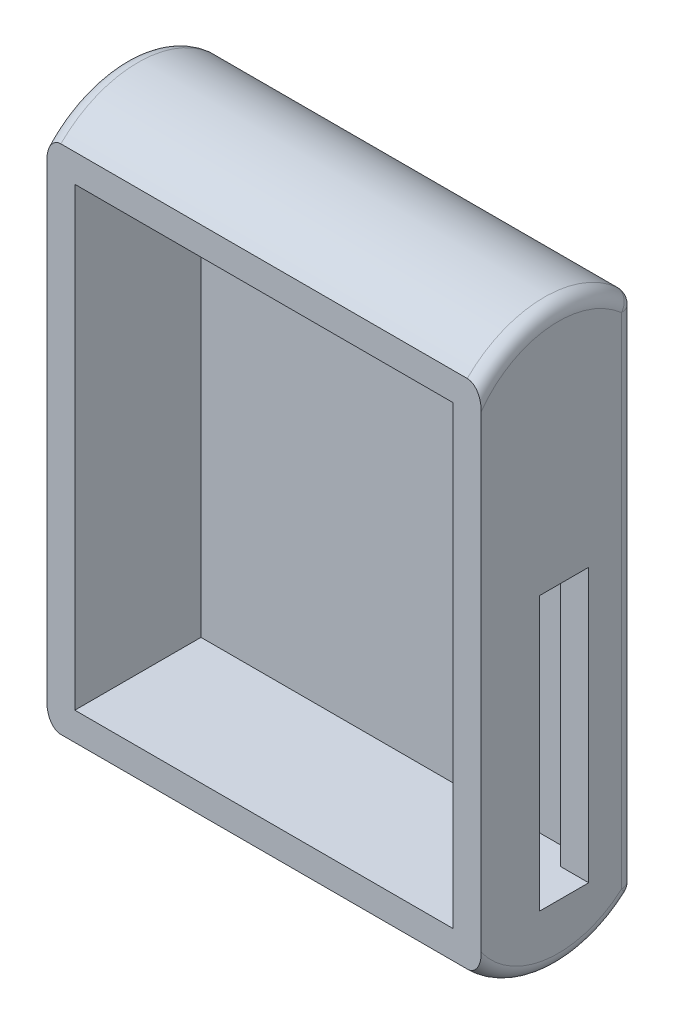
ISO-10303-21;
HEADER;
FILE_DESCRIPTION(('STEP AP214'),'2;1');
FILE_NAME('part.step','',(''),(''),'','','');
FILE_SCHEMA(('AUTOMOTIVE_DESIGN { 1 0 10303 214 1 1 1 1 }'));
ENDSEC;
DATA;
#1=APPLICATION_CONTEXT('core data for automotive mechanical design processes');
#2=APPLICATION_PROTOCOL_DEFINITION('international standard','automotive_design',2000,#1);
#3=PRODUCT_CONTEXT('',#1,'mechanical');
#4=PRODUCT('Part','Part','',(#3));
#5=PRODUCT_RELATED_PRODUCT_CATEGORY('part','',(#4));
#6=PRODUCT_DEFINITION_FORMATION('','',#4);
#7=PRODUCT_DEFINITION_CONTEXT('part definition',#1,'design');
#8=PRODUCT_DEFINITION('design','',#6,#7);
#9=PRODUCT_DEFINITION_SHAPE('','',#8);
#10=(LENGTH_UNIT() NAMED_UNIT(*) SI_UNIT(.MILLI.,.METRE.));
#11=(NAMED_UNIT(*) PLANE_ANGLE_UNIT() SI_UNIT($,.RADIAN.));
#12=(NAMED_UNIT(*) SI_UNIT($,.STERADIAN.) SOLID_ANGLE_UNIT());
#13=UNCERTAINTY_MEASURE_WITH_UNIT(LENGTH_MEASURE(1.E-05),#10,'distance_accuracy_value','');
#14=(GEOMETRIC_REPRESENTATION_CONTEXT(3) GLOBAL_UNCERTAINTY_ASSIGNED_CONTEXT((#13)) GLOBAL_UNIT_ASSIGNED_CONTEXT((#10,
#11,#12)) REPRESENTATION_CONTEXT('',''));
#15=CARTESIAN_POINT('',(0.,0.,0.));
#16=DIRECTION('',(0.,0.,1.));
#17=DIRECTION('',(1.,0.,0.));
#18=AXIS2_PLACEMENT_3D('',#15,#16,#17);
#19=CARTESIAN_POINT('',(0.,0.,0.));
#20=DIRECTION('',(0.,0.,1.));
#21=DIRECTION('',(1.,0.,0.));
#22=AXIS2_PLACEMENT_3D('',#19,#20,#21);
#23=PLANE('',#22);
#24=DIRECTION('',(-1.,0.,0.));
#25=VECTOR('',#24,1.);
#26=CARTESIAN_POINT('',(-15.5,-17.8188904914089,0.));
#27=LINE('',#26,#25);
#28=CARTESIAN_POINT('',(14.5,-17.8188904914089,0.));
#29=VERTEX_POINT('',#28);
#30=CARTESIAN_POINT('',(-14.5,-17.8188904914089,0.));
#31=VERTEX_POINT('',#30);
#32=EDGE_CURVE('E258',#29,#31,#27,.T.);
#33=ORIENTED_EDGE('',*,*,#32,.T.);
#34=DIRECTION('',(0.,-1.,0.));
#35=VECTOR('',#34,1.);
#36=CARTESIAN_POINT('',(-14.5,0.,0.));
#37=LINE('',#36,#35);
#38=CARTESIAN_POINT('',(-14.5,17.8188904914089,0.));
#39=VERTEX_POINT('',#38);
#40=EDGE_CURVE('E11',#31,#39,#37,.F.);
#41=ORIENTED_EDGE('',*,*,#40,.T.);
#42=DIRECTION('',(-1.,0.,0.));
#43=VECTOR('',#42,1.);
#44=CARTESIAN_POINT('',(14.5,17.8188904914089,0.));
#45=LINE('',#44,#43);
#46=CARTESIAN_POINT('',(14.5,17.8188904914089,0.));
#47=VERTEX_POINT('',#46);
#48=EDGE_CURVE('E306',#39,#47,#45,.F.);
#49=ORIENTED_EDGE('',*,*,#48,.T.);
#50=DIRECTION('',(0.,1.,0.));
#51=VECTOR('',#50,1.);
#52=CARTESIAN_POINT('',(14.5,0.,0.));
#53=LINE('',#52,#51);
#54=EDGE_CURVE('E251',#47,#29,#53,.F.);
#55=ORIENTED_EDGE('',*,*,#54,.T.);
#56=EDGE_LOOP('',(#33,#41,#49,#55));
#57=FACE_BOUND('',#56,.T.);
#58=ADVANCED_FACE('F37',(#57),#23,.F.);
#59=CARTESIAN_POINT('',(15.5,18.25,9.));
#60=DIRECTION('',(-1.,0.,0.));
#61=DIRECTION('',(0.,0.,1.));
#62=AXIS2_PLACEMENT_3D('',#59,#60,#61);
#63=PLANE('',#62);
#64=DIRECTION('',(0.,0.,1.));
#65=VECTOR('',#64,1.);
#66=CARTESIAN_POINT('',(15.5,-16.25,9.));
#67=LINE('',#66,#65);
#68=CARTESIAN_POINT('',(15.5,-16.25,3.33269746106328));
#69=VERTEX_POINT('',#68);
#70=CARTESIAN_POINT('',(15.5,-16.25,6.83269746106328));
#71=VERTEX_POINT('',#70);
#72=EDGE_CURVE('E194',#69,#71,#67,.T.);
#73=ORIENTED_EDGE('',*,*,#72,.T.);
#74=DIRECTION('',(0.,1.,0.));
#75=VECTOR('',#74,1.);
#76=CARTESIAN_POINT('',(15.5,18.25,6.83269746106328));
#77=LINE('',#76,#75);
#78=CARTESIAN_POINT('',(15.5,3.25000000000001,6.83269746106328));
#79=VERTEX_POINT('',#78);
#80=EDGE_CURVE('E197',#71,#79,#77,.T.);
#81=ORIENTED_EDGE('',*,*,#80,.T.);
#82=DIRECTION('',(0.,0.,-1.));
#83=VECTOR('',#82,1.);
#84=CARTESIAN_POINT('',(15.5,3.25000000000001,9.));
#85=LINE('',#84,#83);
#86=CARTESIAN_POINT('',(15.5,3.25000000000001,3.33269746106328));
#87=VERTEX_POINT('',#86);
#88=EDGE_CURVE('E169',#79,#87,#85,.T.);
#89=ORIENTED_EDGE('',*,*,#88,.T.);
#90=DIRECTION('',(0.,-1.,0.));
#91=VECTOR('',#90,1.);
#92=CARTESIAN_POINT('',(15.5,18.25,3.33269746106328));
#93=LINE('',#92,#91);
#94=EDGE_CURVE('E191',#87,#69,#93,.T.);
#95=ORIENTED_EDGE('',*,*,#94,.T.);
#96=EDGE_LOOP('',(#73,#81,#89,#95));
#97=FACE_BOUND('',#96,.T.);
#98=DIRECTION('',(0.,1.,0.));
#99=VECTOR('',#98,1.);
#100=CARTESIAN_POINT('',(15.5,18.25,0.999999999999999));
#101=LINE('',#100,#99);
#102=CARTESIAN_POINT('',(15.5,-17.8188904914089,0.999999999999999));
#103=VERTEX_POINT('',#102);
#104=CARTESIAN_POINT('',(15.5,17.8188904914089,0.999999999999999));
#105=VERTEX_POINT('',#104);
#106=EDGE_CURVE('E248',#103,#105,#101,.T.);
#107=ORIENTED_EDGE('',*,*,#106,.T.);
#108=CARTESIAN_POINT('',(15.5,12.75,5.5));
#109=DIRECTION('',(-1.,0.,0.));
#110=DIRECTION('',(0.,0.,1.));
#111=AXIS2_PLACEMENT_3D('',#108,#109,#110);
#112=CIRCLE('',#111,6.77817459305202);
#113=CARTESIAN_POINT('',(15.5,16.7115212752043,11.));
#114=VERTEX_POINT('',#113);
#115=EDGE_CURVE('E300',#105,#114,#112,.F.);
#116=ORIENTED_EDGE('',*,*,#115,.T.);
#117=DIRECTION('',(0.,1.,0.));
#118=VECTOR('',#117,1.);
#119=CARTESIAN_POINT('',(15.5,18.25,11.));
#120=LINE('',#119,#118);
#121=CARTESIAN_POINT('',(15.5,-16.7115212752043,11.));
#122=VERTEX_POINT('',#121);
#123=EDGE_CURVE('E222',#122,#114,#120,.T.);
#124=ORIENTED_EDGE('',*,*,#123,.F.);
#125=CARTESIAN_POINT('',(15.5,-12.75,5.5));
#126=DIRECTION('',(-1.,0.,0.));
#127=DIRECTION('',(0.,0.,1.));
#128=AXIS2_PLACEMENT_3D('',#125,#126,#127);
#129=CIRCLE('',#128,6.77817459305203);
#130=EDGE_CURVE('E261',#122,#103,#129,.F.);
#131=ORIENTED_EDGE('',*,*,#130,.T.);
#132=EDGE_LOOP('',(#107,#116,#124,#131));
#133=FACE_BOUND('',#132,.T.);
#134=ADVANCED_FACE('F355',(#97,#133),#63,.F.);
#135=CARTESIAN_POINT('',(-15.5,18.25,9.));
#136=DIRECTION('',(1.,0.,0.));
#137=DIRECTION('',(0.,1.,0.));
#138=AXIS2_PLACEMENT_3D('',#135,#136,#137);
#139=PLANE('',#138);
#140=DIRECTION('',(0.,-1.,0.));
#141=VECTOR('',#140,1.);
#142=CARTESIAN_POINT('',(-15.5,18.25,11.));
#143=LINE('',#142,#141);
#144=CARTESIAN_POINT('',(-15.5,16.7115212752043,11.));
#145=VERTEX_POINT('',#144);
#146=CARTESIAN_POINT('',(-15.5,-16.7115212752043,11.));
#147=VERTEX_POINT('',#146);
#148=EDGE_CURVE('E228',#145,#147,#143,.T.);
#149=ORIENTED_EDGE('',*,*,#148,.F.);
#150=CARTESIAN_POINT('',(-15.5,12.75,5.5));
#151=DIRECTION('',(1.,0.,0.));
#152=DIRECTION('',(0.,1.,0.));
#153=AXIS2_PLACEMENT_3D('',#150,#151,#152);
#154=CIRCLE('',#153,6.77817459305202);
#155=CARTESIAN_POINT('',(-15.5,17.8188904914089,0.999999999999999));
#156=VERTEX_POINT('',#155);
#157=EDGE_CURVE('E435',#145,#156,#154,.F.);
#158=ORIENTED_EDGE('',*,*,#157,.T.);
#159=DIRECTION('',(0.,-1.,0.));
#160=VECTOR('',#159,1.);
#161=CARTESIAN_POINT('',(-15.5,18.25,0.999999999999999));
#162=LINE('',#161,#160);
#163=CARTESIAN_POINT('',(-15.5,-17.8188904914089,0.999999999999999));
#164=VERTEX_POINT('',#163);
#165=EDGE_CURVE('E331',#156,#164,#162,.T.);
#166=ORIENTED_EDGE('',*,*,#165,.T.);
#167=CARTESIAN_POINT('',(-15.5,-12.75,5.5));
#168=DIRECTION('',(1.,0.,0.));
#169=DIRECTION('',(0.,1.,0.));
#170=AXIS2_PLACEMENT_3D('',#167,#168,#169);
#171=CIRCLE('',#170,6.77817459305203);
#172=EDGE_CURVE('E394',#164,#147,#171,.F.);
#173=ORIENTED_EDGE('',*,*,#172,.T.);
#174=EDGE_LOOP('',(#149,#158,#166,#173));
#175=FACE_BOUND('',#174,.T.);
#176=ADVANCED_FACE('F361',(#175),#139,.F.);
#177=CARTESIAN_POINT('',(13.5,-16.25,9.));
#178=DIRECTION('',(-1.,0.,0.));
#179=DIRECTION('',(0.,0.,1.));
#180=AXIS2_PLACEMENT_3D('',#177,#178,#179);
#181=PLANE('',#180);
#182=DIRECTION('',(0.,1.,0.));
#183=VECTOR('',#182,1.);
#184=CARTESIAN_POINT('',(13.5,-16.25,6.83269746106328));
#185=LINE('',#184,#183);
#186=CARTESIAN_POINT('',(13.5,-16.25,6.83269746106328));
#187=VERTEX_POINT('',#186);
#188=CARTESIAN_POINT('',(13.5,3.25000000000001,6.83269746106328));
#189=VERTEX_POINT('',#188);
#190=EDGE_CURVE('E174',#187,#189,#185,.T.);
#191=ORIENTED_EDGE('',*,*,#190,.F.);
#192=DIRECTION('',(0.,0.,-1.));
#193=VECTOR('',#192,1.);
#194=CARTESIAN_POINT('',(13.5,-16.25,9.));
#195=LINE('',#194,#193);
#196=CARTESIAN_POINT('',(13.5,-16.25,11.));
#197=VERTEX_POINT('',#196);
#198=EDGE_CURVE('E234',#197,#187,#195,.T.);
#199=ORIENTED_EDGE('',*,*,#198,.F.);
#200=DIRECTION('',(0.,1.,0.));
#201=VECTOR('',#200,1.);
#202=CARTESIAN_POINT('',(13.5,-16.25,11.));
#203=LINE('',#202,#201);
#204=CARTESIAN_POINT('',(13.5,16.25,11.));
#205=VERTEX_POINT('',#204);
#206=EDGE_CURVE('E210',#197,#205,#203,.T.);
#207=ORIENTED_EDGE('',*,*,#206,.T.);
#208=DIRECTION('',(0.,0.,-1.));
#209=VECTOR('',#208,1.);
#210=CARTESIAN_POINT('',(13.5,16.25,9.));
#211=LINE('',#210,#209);
#212=CARTESIAN_POINT('',(13.5,16.25,2.));
#213=VERTEX_POINT('',#212);
#214=EDGE_CURVE('E242',#205,#213,#211,.T.);
#215=ORIENTED_EDGE('',*,*,#214,.T.);
#216=DIRECTION('',(0.,1.,0.));
#217=VECTOR('',#216,1.);
#218=CARTESIAN_POINT('',(13.5,-16.25,2.));
#219=LINE('',#218,#217);
#220=CARTESIAN_POINT('',(13.5,-16.25,2.));
#221=VERTEX_POINT('',#220);
#222=EDGE_CURVE('E207',#221,#213,#219,.T.);
#223=ORIENTED_EDGE('',*,*,#222,.F.);
#224=CARTESIAN_POINT('',(13.5,-16.25,3.33269746106328));
#225=VERTEX_POINT('',#224);
#226=EDGE_CURVE('E233',#225,#221,#195,.T.);
#227=ORIENTED_EDGE('',*,*,#226,.F.);
#228=DIRECTION('',(0.,-1.,0.));
#229=VECTOR('',#228,1.);
#230=CARTESIAN_POINT('',(13.5,-16.25,3.33269746106328));
#231=LINE('',#230,#229);
#232=CARTESIAN_POINT('',(13.5,3.25000000000001,3.33269746106328));
#233=VERTEX_POINT('',#232);
#234=EDGE_CURVE('E62',#233,#225,#231,.T.);
#235=ORIENTED_EDGE('',*,*,#234,.F.);
#236=DIRECTION('',(0.,0.,-1.));
#237=VECTOR('',#236,1.);
#238=CARTESIAN_POINT('',(13.5,3.25000000000001,6.83269746106328));
#239=LINE('',#238,#237);
#240=EDGE_CURVE('E167',#189,#233,#239,.T.);
#241=ORIENTED_EDGE('',*,*,#240,.F.);
#242=EDGE_LOOP('',(#191,#199,#207,#215,#223,#227,#235,#241));
#243=FACE_BOUND('',#242,.T.);
#244=ADVANCED_FACE('F181',(#243),#181,.T.);
#245=CARTESIAN_POINT('',(-13.5,16.25,9.));
#246=DIRECTION('',(0.,-1.,0.));
#247=DIRECTION('',(0.,0.,-1.));
#248=AXIS2_PLACEMENT_3D('',#245,#246,#247);
#249=PLANE('',#248);
#250=DIRECTION('',(-1.,0.,0.));
#251=VECTOR('',#250,1.);
#252=CARTESIAN_POINT('',(-13.5,16.25,2.));
#253=LINE('',#252,#251);
#254=CARTESIAN_POINT('',(-13.5,16.25,2.));
#255=VERTEX_POINT('',#254);
#256=EDGE_CURVE('E203',#213,#255,#253,.T.);
#257=ORIENTED_EDGE('',*,*,#256,.F.);
#258=ORIENTED_EDGE('',*,*,#214,.F.);
#259=DIRECTION('',(-1.,0.,0.));
#260=VECTOR('',#259,1.);
#261=CARTESIAN_POINT('',(-13.5,16.25,11.));
#262=LINE('',#261,#260);
#263=CARTESIAN_POINT('',(-13.5,16.25,11.));
#264=VERTEX_POINT('',#263);
#265=EDGE_CURVE('E213',#205,#264,#262,.T.);
#266=ORIENTED_EDGE('',*,*,#265,.T.);
#267=DIRECTION('',(0.,0.,-1.));
#268=VECTOR('',#267,1.);
#269=CARTESIAN_POINT('',(-13.5,16.25,9.));
#270=LINE('',#269,#268);
#271=EDGE_CURVE('E239',#264,#255,#270,.T.);
#272=ORIENTED_EDGE('',*,*,#271,.T.);
#273=EDGE_LOOP('',(#257,#258,#266,#272));
#274=FACE_BOUND('',#273,.T.);
#275=ADVANCED_FACE('F466',(#274),#249,.T.);
#276=CARTESIAN_POINT('',(-13.5,-16.25,9.));
#277=DIRECTION('',(1.,0.,0.));
#278=DIRECTION('',(0.,0.,-1.));
#279=AXIS2_PLACEMENT_3D('',#276,#277,#278);
#280=PLANE('',#279);
#281=DIRECTION('',(0.,-1.,0.));
#282=VECTOR('',#281,1.);
#283=CARTESIAN_POINT('',(-13.5,-16.25,2.));
#284=LINE('',#283,#282);
#285=CARTESIAN_POINT('',(-13.5,-16.25,2.));
#286=VERTEX_POINT('',#285);
#287=EDGE_CURVE('E200',#255,#286,#284,.T.);
#288=ORIENTED_EDGE('',*,*,#287,.F.);
#289=ORIENTED_EDGE('',*,*,#271,.F.);
#290=DIRECTION('',(0.,-1.,0.));
#291=VECTOR('',#290,1.);
#292=CARTESIAN_POINT('',(-13.5,-16.25,11.));
#293=LINE('',#292,#291);
#294=CARTESIAN_POINT('',(-13.5,-16.25,11.));
#295=VERTEX_POINT('',#294);
#296=EDGE_CURVE('E216',#264,#295,#293,.T.);
#297=ORIENTED_EDGE('',*,*,#296,.T.);
#298=DIRECTION('',(0.,0.,-1.));
#299=VECTOR('',#298,1.);
#300=CARTESIAN_POINT('',(-13.5,-16.25,9.));
#301=LINE('',#300,#299);
#302=EDGE_CURVE('E236',#295,#286,#301,.T.);
#303=ORIENTED_EDGE('',*,*,#302,.T.);
#304=EDGE_LOOP('',(#288,#289,#297,#303));
#305=FACE_BOUND('',#304,.T.);
#306=ADVANCED_FACE('F460',(#305),#280,.T.);
#307=CARTESIAN_POINT('',(-13.5,-16.25,9.));
#308=DIRECTION('',(0.,1.,0.));
#309=DIRECTION('',(0.,0.,1.));
#310=AXIS2_PLACEMENT_3D('',#307,#308,#309);
#311=PLANE('',#310);
#312=DIRECTION('',(1.,0.,0.));
#313=VECTOR('',#312,1.);
#314=CARTESIAN_POINT('',(-13.5,-16.25,2.));
#315=LINE('',#314,#313);
#316=EDGE_CURVE('E245',#286,#221,#315,.T.);
#317=ORIENTED_EDGE('',*,*,#316,.F.);
#318=ORIENTED_EDGE('',*,*,#302,.F.);
#319=DIRECTION('',(1.,0.,0.));
#320=VECTOR('',#319,1.);
#321=CARTESIAN_POINT('',(-13.5,-16.25,11.));
#322=LINE('',#321,#320);
#323=EDGE_CURVE('E219',#295,#197,#322,.T.);
#324=ORIENTED_EDGE('',*,*,#323,.T.);
#325=ORIENTED_EDGE('',*,*,#198,.T.);
#326=DIRECTION('',(-1.,0.,0.));
#327=VECTOR('',#326,1.);
#328=CARTESIAN_POINT('',(44.5,-16.25,6.83269746106328));
#329=LINE('',#328,#327);
#330=EDGE_CURVE('E177',#71,#187,#329,.T.);
#331=ORIENTED_EDGE('',*,*,#330,.F.);
#332=ORIENTED_EDGE('',*,*,#72,.F.);
#333=DIRECTION('',(-1.,0.,0.));
#334=VECTOR('',#333,1.);
#335=CARTESIAN_POINT('',(44.5,-16.25,3.33269746106328));
#336=LINE('',#335,#334);
#337=EDGE_CURVE('E187',#69,#225,#336,.T.);
#338=ORIENTED_EDGE('',*,*,#337,.T.);
#339=ORIENTED_EDGE('',*,*,#226,.T.);
#340=EDGE_LOOP('',(#317,#318,#324,#325,#331,#332,#338,#339));
#341=FACE_BOUND('',#340,.T.);
#342=ADVANCED_FACE('F456',(#341),#311,.T.);
#343=CARTESIAN_POINT('',(0.,0.,11.));
#344=DIRECTION('',(0.,0.,1.));
#345=DIRECTION('',(1.,0.,0.));
#346=AXIS2_PLACEMENT_3D('',#343,#344,#345);
#347=PLANE('',#346);
#348=DIRECTION('',(-1.,0.,0.));
#349=VECTOR('',#348,1.);
#350=CARTESIAN_POINT('',(-15.5,18.25,11.));
#351=LINE('',#350,#349);
#352=CARTESIAN_POINT('',(14.5,18.25,11.));
#353=VERTEX_POINT('',#352);
#354=CARTESIAN_POINT('',(-14.5,18.25,11.));
#355=VERTEX_POINT('',#354);
#356=EDGE_CURVE('E225',#353,#355,#351,.T.);
#357=ORIENTED_EDGE('',*,*,#356,.T.);
#358=CARTESIAN_POINT('',(-14.5,18.25,11.));
#359=CARTESIAN_POINT('',(-14.5221746388345,18.2500035217024,11.));
#360=CARTESIAN_POINT('',(-14.5443359806786,18.2489560098945,11.));
#361=CARTESIAN_POINT('',(-14.5884502003951,18.2448023064981,11.));
#362=CARTESIAN_POINT('',(-14.6104032088881,18.2416975050493,11.));
#363=CARTESIAN_POINT('',(-14.6753444611963,18.2294313668087,11.));
#364=CARTESIAN_POINT('',(-14.7178052242068,18.2173165748259,11.));
#365=CARTESIAN_POINT('',(-14.7998833291316,18.1860749257143,11.));
#366=CARTESIAN_POINT('',(-14.8395070601081,18.1669644575222,11.));
#367=CARTESIAN_POINT('',(-14.9153654595189,18.1228185252904,11.));
#368=CARTESIAN_POINT('',(-14.9515930051118,18.0977709809261,11.));
#369=CARTESIAN_POINT('',(-15.0331103296372,18.0325871217042,11.));
#370=CARTESIAN_POINT('',(-15.07669166003,17.9903173454604,11.));
#371=CARTESIAN_POINT('',(-15.156462459106,17.8993551457087,11.));
#372=CARTESIAN_POINT('',(-15.1926416294551,17.850653927217,11.));
#373=CARTESIAN_POINT('',(-15.2721736159704,17.7267500628287,11.));
#374=CARTESIAN_POINT('',(-15.3118520971225,17.6492015077571,11.));
#375=CARTESIAN_POINT('',(-15.3787360924516,17.4887037275891,11.));
#376=CARTESIAN_POINT('',(-15.4058866459234,17.4057324945112,11.));
#377=CARTESIAN_POINT('',(-15.4404670543295,17.2713948968963,11.));
#378=CARTESIAN_POINT('',(-15.4514270024044,17.2208907790921,11.));
#379=CARTESIAN_POINT('',(-15.4698458775689,17.1192221448691,11.));
#380=CARTESIAN_POINT('',(-15.4773032233433,17.0680573408611,11.));
#381=CARTESIAN_POINT('',(-15.4889293631659,16.9660390728593,11.));
#382=CARTESIAN_POINT('',(-15.4931395877876,16.9151901884607,11.));
#383=CARTESIAN_POINT('',(-15.4986702573794,16.8133966185451,11.));
#384=CARTESIAN_POINT('',(-15.4999942928386,16.7624521310589,11.));
#385=CARTESIAN_POINT('',(-15.5,16.7115212752043,11.));
#386=B_SPLINE_CURVE_WITH_KNOTS('',3,(#358,#359,#360,#361,#362,#363,#364,#365,#366,#367,#368,
#369,#370,#371,#372,#373,#374,#375,#376,#377,#378,#379,#380,#381,#382,#383,#384,#385),
.UNSPECIFIED.,.F.,.F.,(4,2,2,2,2,2,2,2,2,2,2,2,2,4),(0.,0.0664738702492997,0.132902868904628,
0.264608044699189,0.396006625901944,0.527674897712099,0.70880799378726,0.89019140480687,
1.15009376099176,1.41112572895081,1.5660534987603,1.72105114653713,1.87403684529202,
2.02683211727188),.UNSPECIFIED.);
#387=EDGE_CURVE('E325',#355,#145,#386,.T.);
#388=ORIENTED_EDGE('',*,*,#387,.T.);
#389=ORIENTED_EDGE('',*,*,#148,.T.);
#390=CARTESIAN_POINT('',(-15.5,-16.7115212752043,11.));
#391=CARTESIAN_POINT('',(-15.4999785321036,-16.7822100063063,11.));
#392=CARTESIAN_POINT('',(-15.4974362885207,-16.8529609974941,11.));
#393=CARTESIAN_POINT('',(-15.4865898481842,-16.9943727818772,11.));
#394=CARTESIAN_POINT('',(-15.4782563545034,-17.0650312780709,11.));
#395=CARTESIAN_POINT('',(-15.4549112889245,-17.2064110185702,11.));
#396=CARTESIAN_POINT('',(-15.4397970454249,-17.2771158717378,11.));
#397=CARTESIAN_POINT('',(-15.401997744811,-17.4163453729328,11.));
#398=CARTESIAN_POINT('',(-15.3793305227153,-17.4848747443337,11.));
#399=CARTESIAN_POINT('',(-15.3277467276094,-17.6127199945185,11.));
#400=CARTESIAN_POINT('',(-15.2995426418784,-17.6723194814887,11.));
#401=CARTESIAN_POINT('',(-15.2352631254096,-17.7869180694732,11.));
#402=CARTESIAN_POINT('',(-15.1992182444532,-17.8419339099716,11.));
#403=CARTESIAN_POINT('',(-15.1247920229361,-17.9373761881579,11.));
#404=CARTESIAN_POINT('',(-15.0876285370698,-17.9787440746335,11.));
#405=CARTESIAN_POINT('',(-15.0070315764979,-18.0549385991991,11.));
#406=CARTESIAN_POINT('',(-14.9636026412766,-18.0897699315153,11.));
#407=CARTESIAN_POINT('',(-14.8805864508777,-18.1443365525857,11.));
#408=CARTESIAN_POINT('',(-14.8420750078161,-18.1657047010387,11.));
#409=CARTESIAN_POINT('',(-14.762073019021,-18.2017622310262,11.));
#410=CARTESIAN_POINT('',(-14.7205886629884,-18.2164650475421,11.));
#411=CARTESIAN_POINT('',(-14.6491025604798,-18.2348069360862,11.));
#412=CARTESIAN_POINT('',(-14.6196107022979,-18.2404734962374,11.));
#413=CARTESIAN_POINT('',(-14.5600884253646,-18.2480835352641,11.));
#414=CARTESIAN_POINT('',(-14.5300569881199,-18.2500190113908,11.));
#415=CARTESIAN_POINT('',(-14.5,-18.25,11.));
#416=B_SPLINE_CURVE_WITH_KNOTS('',3,(#390,#391,#392,#393,#394,#395,#396,#397,#398,#399,#400,
#401,#402,#403,#404,#405,#406,#407,#408,#409,#410,#411,#412,#413,#414,#415),.UNSPECIFIED.,.F.,
.F.,(4,2,2,2,2,2,2,2,2,2,2,2,4),(0.,0.212115816470039,0.425312576398679,0.641852534891687,
0.857884754022996,1.05518100540993,1.25172188521054,1.41794870498179,1.58405568827502,
1.71565949470072,1.84699684132447,1.9368678810772,2.02693147039582),.UNSPECIFIED.);
#417=CARTESIAN_POINT('',(-14.5,-18.25,11.));
#418=VERTEX_POINT('',#417);
#419=EDGE_CURVE('E320',#147,#418,#416,.T.);
#420=ORIENTED_EDGE('',*,*,#419,.T.);
#421=DIRECTION('',(1.,0.,0.));
#422=VECTOR('',#421,1.);
#423=CARTESIAN_POINT('',(-15.5,-18.25,11.));
#424=LINE('',#423,#422);
#425=CARTESIAN_POINT('',(14.5,-18.25,11.));
#426=VERTEX_POINT('',#425);
#427=EDGE_CURVE('E231',#418,#426,#424,.T.);
#428=ORIENTED_EDGE('',*,*,#427,.T.);
#429=CARTESIAN_POINT('',(14.5,-18.25,11.));
#430=CARTESIAN_POINT('',(14.5221746388345,-18.2500035217024,11.));
#431=CARTESIAN_POINT('',(14.5443359806786,-18.2489560098945,11.));
#432=CARTESIAN_POINT('',(14.5884502003951,-18.2448023064981,11.));
#433=CARTESIAN_POINT('',(14.6104032088881,-18.2416975050493,11.));
#434=CARTESIAN_POINT('',(14.6753444611963,-18.2294313668087,11.));
#435=CARTESIAN_POINT('',(14.7178052242068,-18.2173165748259,11.));
#436=CARTESIAN_POINT('',(14.7998833291316,-18.1860749257143,11.));
#437=CARTESIAN_POINT('',(14.8395070601081,-18.1669644575222,11.));
#438=CARTESIAN_POINT('',(14.9153654595189,-18.1228185252904,11.));
#439=CARTESIAN_POINT('',(14.9515930051118,-18.097770980926,11.));
#440=CARTESIAN_POINT('',(15.0331103296372,-18.0325871217042,11.));
#441=CARTESIAN_POINT('',(15.07669166003,-17.9903173454604,11.));
#442=CARTESIAN_POINT('',(15.156462459106,-17.8993551457087,11.));
#443=CARTESIAN_POINT('',(15.1926416294551,-17.850653927217,11.));
#444=CARTESIAN_POINT('',(15.2721736159704,-17.7267500628287,11.));
#445=CARTESIAN_POINT('',(15.3118520971225,-17.6492015077571,11.));
#446=CARTESIAN_POINT('',(15.3787360924516,-17.4887037275891,11.));
#447=CARTESIAN_POINT('',(15.4058866459234,-17.4057324945112,11.));
#448=CARTESIAN_POINT('',(15.4404670543295,-17.2713948968963,11.));
#449=CARTESIAN_POINT('',(15.4514270024044,-17.2208907790921,11.));
#450=CARTESIAN_POINT('',(15.4698458775689,-17.1192221448691,11.));
#451=CARTESIAN_POINT('',(15.4773032233433,-17.0680573408611,11.));
#452=CARTESIAN_POINT('',(15.4889293631659,-16.9660390728593,11.));
#453=CARTESIAN_POINT('',(15.4931395877876,-16.9151901884607,11.));
#454=CARTESIAN_POINT('',(15.4986702573794,-16.8133966185451,11.));
#455=CARTESIAN_POINT('',(15.4999942928386,-16.7624521310589,11.));
#456=CARTESIAN_POINT('',(15.5,-16.7115212752043,11.));
#457=B_SPLINE_CURVE_WITH_KNOTS('',3,(#429,#430,#431,#432,#433,#434,#435,#436,#437,#438,#439,
#440,#441,#442,#443,#444,#445,#446,#447,#448,#449,#450,#451,#452,#453,#454,#455,#456),
.UNSPECIFIED.,.F.,.F.,(4,2,2,2,2,2,2,2,2,2,2,2,2,4),(0.,0.0664738702492996,0.132902868904632,
0.264608044699191,0.396006625901948,0.527674897712102,0.708807993787261,0.890191404806871,
1.15009376099175,1.41112572895081,1.5660534987603,1.72105114653713,1.87403684529202,
2.02683211727188),.UNSPECIFIED.);
#458=EDGE_CURVE('E263',#426,#122,#457,.T.);
#459=ORIENTED_EDGE('',*,*,#458,.T.);
#460=ORIENTED_EDGE('',*,*,#123,.T.);
#461=CARTESIAN_POINT('',(15.5,16.7115212752043,11.));
#462=CARTESIAN_POINT('',(15.4999785321036,16.7822100063063,11.));
#463=CARTESIAN_POINT('',(15.4974362885207,16.8529609974941,11.));
#464=CARTESIAN_POINT('',(15.4865898481842,16.9943727818772,11.));
#465=CARTESIAN_POINT('',(15.4782563545034,17.0650312780709,11.));
#466=CARTESIAN_POINT('',(15.4549112889245,17.2064110185702,11.));
#467=CARTESIAN_POINT('',(15.4397970454249,17.2771158717378,11.));
#468=CARTESIAN_POINT('',(15.401997744811,17.4163453729328,11.));
#469=CARTESIAN_POINT('',(15.3793305227153,17.4848747443337,11.));
#470=CARTESIAN_POINT('',(15.3277467276094,17.6127199945185,11.));
#471=CARTESIAN_POINT('',(15.2995426418784,17.6723194814887,11.));
#472=CARTESIAN_POINT('',(15.2352631254096,17.7869180694732,11.));
#473=CARTESIAN_POINT('',(15.1992182444532,17.8419339099716,11.));
#474=CARTESIAN_POINT('',(15.1247920229361,17.9373761881579,11.));
#475=CARTESIAN_POINT('',(15.0876285370698,17.9787440746335,11.));
#476=CARTESIAN_POINT('',(15.0070315764979,18.0549385991991,11.));
#477=CARTESIAN_POINT('',(14.9636026412766,18.0897699315153,11.));
#478=CARTESIAN_POINT('',(14.8805864508777,18.1443365525857,11.));
#479=CARTESIAN_POINT('',(14.8420750078161,18.1657047010387,11.));
#480=CARTESIAN_POINT('',(14.762073019021,18.2017622310262,11.));
#481=CARTESIAN_POINT('',(14.7205886629884,18.2164650475421,11.));
#482=CARTESIAN_POINT('',(14.6491025604798,18.2348069360862,11.));
#483=CARTESIAN_POINT('',(14.6196107022979,18.2404734962374,11.));
#484=CARTESIAN_POINT('',(14.5600884253646,18.2480835352641,11.));
#485=CARTESIAN_POINT('',(14.5300569881199,18.2500190113908,11.));
#486=CARTESIAN_POINT('',(14.5,18.25,11.));
#487=B_SPLINE_CURVE_WITH_KNOTS('',3,(#461,#462,#463,#464,#465,#466,#467,#468,#469,#470,#471,
#472,#473,#474,#475,#476,#477,#478,#479,#480,#481,#482,#483,#484,#485,#486),.UNSPECIFIED.,.F.,
.F.,(4,2,2,2,2,2,2,2,2,2,2,2,4),(0.,0.212115816470039,0.425312576398676,0.641852534891687,
0.857884754022995,1.05518100540992,1.25172188521054,1.41794870498179,1.58405568827503,
1.71565949470072,1.84699684132447,1.9368678810772,2.02693147039583),.UNSPECIFIED.);
#488=EDGE_CURVE('E293',#114,#353,#487,.T.);
#489=ORIENTED_EDGE('',*,*,#488,.T.);
#490=EDGE_LOOP('',(#357,#388,#389,#420,#428,#459,#460,#489));
#491=FACE_BOUND('',#490,.T.);
#492=ORIENTED_EDGE('',*,*,#265,.F.);
#493=ORIENTED_EDGE('',*,*,#206,.F.);
#494=ORIENTED_EDGE('',*,*,#323,.F.);
#495=ORIENTED_EDGE('',*,*,#296,.F.);
#496=EDGE_LOOP('',(#492,#493,#494,#495));
#497=FACE_BOUND('',#496,.T.);
#498=ADVANCED_FACE('F272',(#491,#497),#347,.T.);
#499=CARTESIAN_POINT('',(0.,0.,2.));
#500=DIRECTION('',(0.,0.,1.));
#501=DIRECTION('',(1.,0.,0.));
#502=AXIS2_PLACEMENT_3D('',#499,#500,#501);
#503=PLANE('',#502);
#504=ORIENTED_EDGE('',*,*,#316,.T.);
#505=ORIENTED_EDGE('',*,*,#222,.T.);
#506=ORIENTED_EDGE('',*,*,#256,.T.);
#507=ORIENTED_EDGE('',*,*,#287,.T.);
#508=EDGE_LOOP('',(#504,#505,#506,#507));
#509=FACE_BOUND('',#508,.T.);
#510=ADVANCED_FACE('F447',(#509),#503,.T.);
#511=CARTESIAN_POINT('',(-15.5,-12.75,5.5));
#512=DIRECTION('',(1.,0.,0.));
#513=DIRECTION('',(0.,0.,-1.));
#514=AXIS2_PLACEMENT_3D('',#511,#512,#513);
#515=CYLINDRICAL_SURFACE('',#514,7.77817459305203);
#516=ORIENTED_EDGE('',*,*,#427,.F.);
#517=CARTESIAN_POINT('',(-14.5,-12.75,5.5));
#518=DIRECTION('',(1.,0.,0.));
#519=DIRECTION('',(0.,1.,0.));
#520=AXIS2_PLACEMENT_3D('',#517,#518,#519);
#521=CIRCLE('',#520,7.77817459305203);
#522=CARTESIAN_POINT('',(-14.5,-18.5667157977392,0.336104442542282));
#523=VERTEX_POINT('',#522);
#524=EDGE_CURVE('E393',#418,#523,#521,.T.);
#525=ORIENTED_EDGE('',*,*,#524,.T.);
#526=DIRECTION('',(1.,0.,0.));
#527=VECTOR('',#526,1.);
#528=CARTESIAN_POINT('',(-15.5,-18.5667157977392,0.336104442542282));
#529=LINE('',#528,#527);
#530=CARTESIAN_POINT('',(14.5,-18.5667157977392,0.336104442542283));
#531=VERTEX_POINT('',#530);
#532=EDGE_CURVE('E256',#523,#531,#529,.T.);
#533=ORIENTED_EDGE('',*,*,#532,.T.);
#534=CARTESIAN_POINT('',(14.5,-12.75,5.5));
#535=DIRECTION('',(-1.,0.,0.));
#536=DIRECTION('',(0.,0.,1.));
#537=AXIS2_PLACEMENT_3D('',#534,#535,#536);
#538=CIRCLE('',#537,7.77817459305203);
#539=EDGE_CURVE('E253',#531,#426,#538,.T.);
#540=ORIENTED_EDGE('',*,*,#539,.T.);
#541=EDGE_LOOP('',(#516,#525,#533,#540));
#542=FACE_BOUND('',#541,.T.);
#543=ADVANCED_FACE('F430',(#542),#515,.T.);
#544=CARTESIAN_POINT('',(-15.5,12.75,5.5));
#545=DIRECTION('',(1.,0.,0.));
#546=DIRECTION('',(0.,0.,-1.));
#547=AXIS2_PLACEMENT_3D('',#544,#545,#546);
#548=CYLINDRICAL_SURFACE('',#547,7.77817459305202);
#549=DIRECTION('',(1.,0.,0.));
#550=VECTOR('',#549,1.);
#551=CARTESIAN_POINT('',(-15.5,18.5667157977392,0.336104442542283));
#552=LINE('',#551,#550);
#553=CARTESIAN_POINT('',(14.5,18.5667157977392,0.336104442542283));
#554=VERTEX_POINT('',#553);
#555=CARTESIAN_POINT('',(-14.5,18.5667157977392,0.336104442542283));
#556=VERTEX_POINT('',#555);
#557=EDGE_CURVE('E299',#554,#556,#552,.F.);
#558=ORIENTED_EDGE('',*,*,#557,.T.);
#559=CARTESIAN_POINT('',(-14.5,12.75,5.5));
#560=DIRECTION('',(1.,0.,0.));
#561=DIRECTION('',(0.,1.,0.));
#562=AXIS2_PLACEMENT_3D('',#559,#560,#561);
#563=CIRCLE('',#562,7.77817459305202);
#564=EDGE_CURVE('E310',#556,#355,#563,.T.);
#565=ORIENTED_EDGE('',*,*,#564,.T.);
#566=ORIENTED_EDGE('',*,*,#356,.F.);
#567=CARTESIAN_POINT('',(14.5,12.75,5.5));
#568=DIRECTION('',(-1.,0.,0.));
#569=DIRECTION('',(0.,0.,1.));
#570=AXIS2_PLACEMENT_3D('',#567,#568,#569);
#571=CIRCLE('',#570,7.77817459305202);
#572=EDGE_CURVE('E304',#353,#554,#571,.T.);
#573=ORIENTED_EDGE('',*,*,#572,.T.);
#574=EDGE_LOOP('',(#558,#565,#566,#573));
#575=FACE_BOUND('',#574,.T.);
#576=ADVANCED_FACE('F371',(#575),#548,.T.);
#577=CARTESIAN_POINT('',(14.5,18.25,0.999999999999999));
#578=DIRECTION('',(0.,1.,0.));
#579=DIRECTION('',(0.,0.,1.));
#580=AXIS2_PLACEMENT_3D('',#577,#578,#579);
#581=CYLINDRICAL_SURFACE('',#580,1.);
#582=ORIENTED_EDGE('',*,*,#54,.F.);
#583=CARTESIAN_POINT('',(14.5,17.8188904914089,0.999999999999999));
#584=DIRECTION('',(0.,1.,0.));
#585=DIRECTION('',(0.,0.,1.));
#586=AXIS2_PLACEMENT_3D('',#583,#584,#585);
#587=CIRCLE('',#586,1.);
#588=EDGE_CURVE('E308',#47,#105,#587,.F.);
#589=ORIENTED_EDGE('',*,*,#588,.T.);
#590=ORIENTED_EDGE('',*,*,#106,.F.);
#591=CARTESIAN_POINT('',(14.5,-17.8188904914089,0.999999999999999));
#592=DIRECTION('',(0.,1.,0.));
#593=DIRECTION('',(0.,0.,1.));
#594=AXIS2_PLACEMENT_3D('',#591,#592,#593);
#595=CIRCLE('',#594,1.);
#596=EDGE_CURVE('E270',#103,#29,#595,.T.);
#597=ORIENTED_EDGE('',*,*,#596,.T.);
#598=EDGE_LOOP('',(#582,#589,#590,#597));
#599=FACE_BOUND('',#598,.T.);
#600=ADVANCED_FACE('F282',(#599),#581,.T.);
#601=CARTESIAN_POINT('',(14.5,-12.75,5.5));
#602=DIRECTION('',(-1.,0.,0.));
#603=DIRECTION('',(0.,0.,1.));
#604=AXIS2_PLACEMENT_3D('',#601,#602,#603);
#605=TOROIDAL_SURFACE('',#604,6.77817459305203,1.);
#606=CARTESIAN_POINT('',(14.5,-17.8188904914089,0.999999999999999));
#607=DIRECTION('',(0.,0.663895557457715,-0.747825306330235));
#608=DIRECTION('',(0.,0.747825306330235,0.663895557457715));
#609=AXIS2_PLACEMENT_3D('',#606,#607,#608);
#610=CIRCLE('',#609,1.);
#611=EDGE_CURVE('E204',#103,#531,#610,.T.);
#612=ORIENTED_EDGE('',*,*,#611,.F.);
#613=ORIENTED_EDGE('',*,*,#130,.F.);
#614=ORIENTED_EDGE('',*,*,#458,.F.);
#615=ORIENTED_EDGE('',*,*,#539,.F.);
#616=EDGE_LOOP('',(#612,#613,#614,#615));
#617=FACE_BOUND('',#616,.T.);
#618=ADVANCED_FACE('F276',(#617),#605,.T.);
#619=CARTESIAN_POINT('',(14.5,-17.8188904914089,0.999999999999999));
#620=DIRECTION('',(0.,-0.747825306330234,-0.663895557457716));
#621=DIRECTION('',(0.,0.663895557457716,-0.747825306330234));
#622=AXIS2_PLACEMENT_3D('',#619,#620,#621);
#623=SPHERICAL_SURFACE('',#622,1.);
#624=ORIENTED_EDGE('',*,*,#596,.F.);
#625=ORIENTED_EDGE('',*,*,#611,.T.);
#626=CARTESIAN_POINT('',(14.5,-17.8188904914089,0.999999999999999));
#627=DIRECTION('',(-1.,0.,0.));
#628=DIRECTION('',(0.,0.,1.));
#629=AXIS2_PLACEMENT_3D('',#626,#627,#628);
#630=CIRCLE('',#629,1.);
#631=EDGE_CURVE('E317',#29,#531,#630,.T.);
#632=ORIENTED_EDGE('',*,*,#631,.F.);
#633=EDGE_LOOP('',(#624,#625,#632));
#634=FACE_BOUND('',#633,.T.);
#635=ADVANCED_FACE('F281',(#634),#623,.T.);
#636=CARTESIAN_POINT('',(-15.5,-17.8188904914089,1.));
#637=DIRECTION('',(1.,0.,0.));
#638=DIRECTION('',(0.,0.,-1.));
#639=AXIS2_PLACEMENT_3D('',#636,#637,#638);
#640=CYLINDRICAL_SURFACE('',#639,1.);
#641=ORIENTED_EDGE('',*,*,#532,.F.);
#642=CARTESIAN_POINT('',(-14.5,-17.8188904914089,1.));
#643=DIRECTION('',(1.,0.,0.));
#644=DIRECTION('',(0.,0.,-1.));
#645=AXIS2_PLACEMENT_3D('',#642,#643,#644);
#646=CIRCLE('',#645,1.);
#647=EDGE_CURVE('E47',#523,#31,#646,.T.);
#648=ORIENTED_EDGE('',*,*,#647,.T.);
#649=ORIENTED_EDGE('',*,*,#32,.F.);
#650=ORIENTED_EDGE('',*,*,#631,.T.);
#651=EDGE_LOOP('',(#641,#648,#649,#650));
#652=FACE_BOUND('',#651,.T.);
#653=ADVANCED_FACE('F373',(#652),#640,.T.);
#654=CARTESIAN_POINT('',(-15.5,17.8188904914089,1.));
#655=DIRECTION('',(1.,0.,0.));
#656=DIRECTION('',(0.,0.,-1.));
#657=AXIS2_PLACEMENT_3D('',#654,#655,#656);
#658=CYLINDRICAL_SURFACE('',#657,1.);
#659=ORIENTED_EDGE('',*,*,#48,.F.);
#660=CARTESIAN_POINT('',(-14.5,17.8188904914089,1.));
#661=DIRECTION('',(1.,0.,0.));
#662=DIRECTION('',(0.,0.,-1.));
#663=AXIS2_PLACEMENT_3D('',#660,#661,#662);
#664=CIRCLE('',#663,1.);
#665=EDGE_CURVE('E400',#39,#556,#664,.T.);
#666=ORIENTED_EDGE('',*,*,#665,.T.);
#667=ORIENTED_EDGE('',*,*,#557,.F.);
#668=CARTESIAN_POINT('',(14.5,17.8188904914089,1.));
#669=DIRECTION('',(1.,0.,0.));
#670=DIRECTION('',(0.,0.,-1.));
#671=AXIS2_PLACEMENT_3D('',#668,#669,#670);
#672=CIRCLE('',#671,1.);
#673=EDGE_CURVE('E314',#47,#554,#672,.T.);
#674=ORIENTED_EDGE('',*,*,#673,.F.);
#675=EDGE_LOOP('',(#659,#666,#667,#674));
#676=FACE_BOUND('',#675,.T.);
#677=ADVANCED_FACE('F339',(#676),#658,.T.);
#678=CARTESIAN_POINT('',(14.5,17.8188904914089,0.999999999999999));
#679=DIRECTION('',(0.,0.747825306330234,-0.663895557457717));
#680=DIRECTION('',(0.,0.663895557457717,0.747825306330234));
#681=AXIS2_PLACEMENT_3D('',#678,#679,#680);
#682=SPHERICAL_SURFACE('',#681,1.);
#683=ORIENTED_EDGE('',*,*,#588,.F.);
#684=ORIENTED_EDGE('',*,*,#673,.T.);
#685=CARTESIAN_POINT('',(14.5,17.8188904914089,0.999999999999999));
#686=DIRECTION('',(0.,0.663895557457717,0.747825306330233));
#687=DIRECTION('',(0.,-0.747825306330233,0.663895557457717));
#688=AXIS2_PLACEMENT_3D('',#685,#686,#687);
#689=CIRCLE('',#688,1.);
#690=EDGE_CURVE('E311',#105,#554,#689,.T.);
#691=ORIENTED_EDGE('',*,*,#690,.F.);
#692=EDGE_LOOP('',(#683,#684,#691));
#693=FACE_BOUND('',#692,.T.);
#694=ADVANCED_FACE('F289',(#693),#682,.T.);
#695=CARTESIAN_POINT('',(14.5,12.75,5.5));
#696=DIRECTION('',(-1.,0.,0.));
#697=DIRECTION('',(0.,0.,1.));
#698=AXIS2_PLACEMENT_3D('',#695,#696,#697);
#699=TOROIDAL_SURFACE('',#698,6.77817459305202,1.);
#700=ORIENTED_EDGE('',*,*,#690,.T.);
#701=ORIENTED_EDGE('',*,*,#572,.F.);
#702=ORIENTED_EDGE('',*,*,#488,.F.);
#703=ORIENTED_EDGE('',*,*,#115,.F.);
#704=EDGE_LOOP('',(#700,#701,#702,#703));
#705=FACE_BOUND('',#704,.T.);
#706=ADVANCED_FACE('F285',(#705),#699,.T.);
#707=CARTESIAN_POINT('',(-14.5,-12.75,5.5));
#708=DIRECTION('',(1.,0.,0.));
#709=DIRECTION('',(0.,1.,0.));
#710=AXIS2_PLACEMENT_3D('',#707,#708,#709);
#711=TOROIDAL_SURFACE('',#710,6.77817459305203,1.);
#712=CARTESIAN_POINT('',(-14.5,-17.8188904914089,0.999999999999997));
#713=DIRECTION('',(0.,0.663895557457715,-0.747825306330235));
#714=DIRECTION('',(0.,0.747825306330235,0.663895557457715));
#715=AXIS2_PLACEMENT_3D('',#712,#713,#714);
#716=CIRCLE('',#715,1.);
#717=EDGE_CURVE('E42',#523,#164,#716,.T.);
#718=ORIENTED_EDGE('',*,*,#717,.F.);
#719=ORIENTED_EDGE('',*,*,#524,.F.);
#720=ORIENTED_EDGE('',*,*,#419,.F.);
#721=ORIENTED_EDGE('',*,*,#172,.F.);
#722=EDGE_LOOP('',(#718,#719,#720,#721));
#723=FACE_BOUND('',#722,.T.);
#724=ADVANCED_FACE('F39',(#723),#711,.T.);
#725=CARTESIAN_POINT('',(-14.5,-17.8188904914089,1.));
#726=DIRECTION('',(1.,0.,0.));
#727=DIRECTION('',(0.,1.,0.));
#728=AXIS2_PLACEMENT_3D('',#725,#726,#727);
#729=SPHERICAL_SURFACE('',#728,1.);
#730=ORIENTED_EDGE('',*,*,#647,.F.);
#731=ORIENTED_EDGE('',*,*,#717,.T.);
#732=CARTESIAN_POINT('',(-14.5,-17.8188904914089,1.));
#733=DIRECTION('',(0.,1.,0.));
#734=DIRECTION('',(0.,0.,1.));
#735=AXIS2_PLACEMENT_3D('',#732,#733,#734);
#736=CIRCLE('',#735,1.);
#737=EDGE_CURVE('E397',#31,#164,#736,.T.);
#738=ORIENTED_EDGE('',*,*,#737,.F.);
#739=EDGE_LOOP('',(#730,#731,#738));
#740=FACE_BOUND('',#739,.T.);
#741=ADVANCED_FACE('F345',(#740),#729,.T.);
#742=CARTESIAN_POINT('',(-14.5,18.25,0.999999999999999));
#743=DIRECTION('',(0.,-1.,0.));
#744=DIRECTION('',(1.,0.,0.));
#745=AXIS2_PLACEMENT_3D('',#742,#743,#744);
#746=CYLINDRICAL_SURFACE('',#745,1.);
#747=CARTESIAN_POINT('',(-14.5,17.8188904914089,1.));
#748=DIRECTION('',(0.,1.,0.));
#749=DIRECTION('',(0.,0.,1.));
#750=AXIS2_PLACEMENT_3D('',#747,#748,#749);
#751=CIRCLE('',#750,1.);
#752=EDGE_CURVE('E406',#39,#156,#751,.T.);
#753=ORIENTED_EDGE('',*,*,#752,.F.);
#754=ORIENTED_EDGE('',*,*,#40,.F.);
#755=ORIENTED_EDGE('',*,*,#737,.T.);
#756=ORIENTED_EDGE('',*,*,#165,.F.);
#757=EDGE_LOOP('',(#753,#754,#755,#756));
#758=FACE_BOUND('',#757,.T.);
#759=ADVANCED_FACE('F342',(#758),#746,.T.);
#760=CARTESIAN_POINT('',(-14.5,17.8188904914089,1.));
#761=DIRECTION('',(1.,0.,0.));
#762=DIRECTION('',(0.,1.,0.));
#763=AXIS2_PLACEMENT_3D('',#760,#761,#762);
#764=SPHERICAL_SURFACE('',#763,1.);
#765=ORIENTED_EDGE('',*,*,#665,.F.);
#766=ORIENTED_EDGE('',*,*,#752,.T.);
#767=CARTESIAN_POINT('',(-14.5,17.8188904914089,1.));
#768=DIRECTION('',(0.,0.663895557457718,0.747825306330233));
#769=DIRECTION('',(0.,-0.747825306330233,0.663895557457718));
#770=AXIS2_PLACEMENT_3D('',#767,#768,#769);
#771=CIRCLE('',#770,1.);
#772=EDGE_CURVE('E199',#556,#156,#771,.T.);
#773=ORIENTED_EDGE('',*,*,#772,.F.);
#774=EDGE_LOOP('',(#765,#766,#773));
#775=FACE_BOUND('',#774,.T.);
#776=ADVANCED_FACE('F337',(#775),#764,.T.);
#777=CARTESIAN_POINT('',(-14.5,12.75,5.5));
#778=DIRECTION('',(1.,0.,0.));
#779=DIRECTION('',(0.,1.,0.));
#780=AXIS2_PLACEMENT_3D('',#777,#778,#779);
#781=TOROIDAL_SURFACE('',#780,6.77817459305202,1.);
#782=ORIENTED_EDGE('',*,*,#772,.T.);
#783=ORIENTED_EDGE('',*,*,#157,.F.);
#784=ORIENTED_EDGE('',*,*,#387,.F.);
#785=ORIENTED_EDGE('',*,*,#564,.F.);
#786=EDGE_LOOP('',(#782,#783,#784,#785));
#787=FACE_BOUND('',#786,.T.);
#788=ADVANCED_FACE('F333',(#787),#781,.T.);
#789=CARTESIAN_POINT('',(44.5,-16.25,6.83269746106328));
#790=DIRECTION('',(0.,0.,1.));
#791=DIRECTION('',(1.,0.,0.));
#792=AXIS2_PLACEMENT_3D('',#789,#790,#791);
#793=PLANE('',#792);
#794=ORIENTED_EDGE('',*,*,#330,.T.);
#795=ORIENTED_EDGE('',*,*,#190,.T.);
#796=DIRECTION('',(-1.,0.,0.));
#797=VECTOR('',#796,1.);
#798=CARTESIAN_POINT('',(44.5,3.25000000000001,6.83269746106328));
#799=LINE('',#798,#797);
#800=EDGE_CURVE('E163',#79,#189,#799,.T.);
#801=ORIENTED_EDGE('',*,*,#800,.F.);
#802=ORIENTED_EDGE('',*,*,#80,.F.);
#803=EDGE_LOOP('',(#794,#795,#801,#802));
#804=FACE_BOUND('',#803,.T.);
#805=ADVANCED_FACE('F175',(#804),#793,.F.);
#806=CARTESIAN_POINT('',(44.5,-16.25,3.33269746106328));
#807=DIRECTION('',(0.,0.,-1.));
#808=DIRECTION('',(-1.,0.,0.));
#809=AXIS2_PLACEMENT_3D('',#806,#807,#808);
#810=PLANE('',#809);
#811=DIRECTION('',(-1.,0.,0.));
#812=VECTOR('',#811,1.);
#813=CARTESIAN_POINT('',(44.5,3.25000000000001,3.33269746106328));
#814=LINE('',#813,#812);
#815=EDGE_CURVE('E55',#87,#233,#814,.T.);
#816=ORIENTED_EDGE('',*,*,#815,.T.);
#817=ORIENTED_EDGE('',*,*,#234,.T.);
#818=ORIENTED_EDGE('',*,*,#337,.F.);
#819=ORIENTED_EDGE('',*,*,#94,.F.);
#820=EDGE_LOOP('',(#816,#817,#818,#819));
#821=FACE_BOUND('',#820,.T.);
#822=ADVANCED_FACE('F596',(#821),#810,.F.);
#823=CARTESIAN_POINT('',(44.5,3.25000000000001,6.83269746106328));
#824=DIRECTION('',(0.,1.,0.));
#825=DIRECTION('',(0.,0.,1.));
#826=AXIS2_PLACEMENT_3D('',#823,#824,#825);
#827=PLANE('',#826);
#828=ORIENTED_EDGE('',*,*,#800,.T.);
#829=ORIENTED_EDGE('',*,*,#240,.T.);
#830=ORIENTED_EDGE('',*,*,#815,.F.);
#831=ORIENTED_EDGE('',*,*,#88,.F.);
#832=EDGE_LOOP('',(#828,#829,#830,#831));
#833=FACE_BOUND('',#832,.T.);
#834=ADVANCED_FACE('F165',(#833),#827,.F.);
#835=CLOSED_SHELL('',(#58,#134,#176,#244,#275,#306,#342,#498,#510,#543,#576,#600,#618,#635,#653,
#677,#694,#706,#724,#741,#759,#776,#788,#805,#822,#834));
#836=MANIFOLD_SOLID_BREP('B2',#835);
#837=ADVANCED_BREP_SHAPE_REPRESENTATION('',(#18,#836),#14);
#838=SHAPE_DEFINITION_REPRESENTATION(#9,#837);
ENDSEC;
END-ISO-10303-21;
